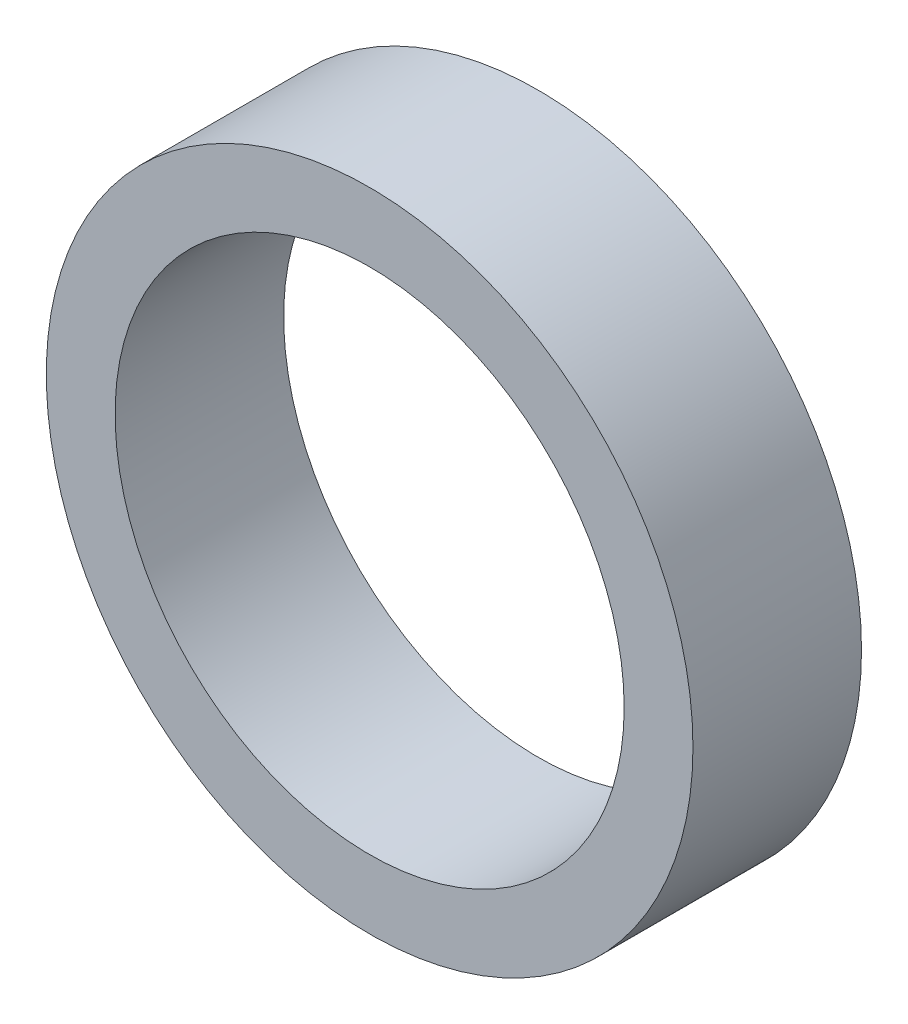
ISO-10303-21;
HEADER;
FILE_DESCRIPTION(('STEP AP214'),'2;1');
FILE_NAME('part.step','',(''),(''),'','','');
FILE_SCHEMA(('AUTOMOTIVE_DESIGN { 1 0 10303 214 1 1 1 1 }'));
ENDSEC;
DATA;
#1=APPLICATION_CONTEXT('core data for automotive mechanical design processes');
#2=APPLICATION_PROTOCOL_DEFINITION('international standard','automotive_design',2000,#1);
#3=PRODUCT_CONTEXT('',#1,'mechanical');
#4=PRODUCT('Part','Part','',(#3));
#5=PRODUCT_RELATED_PRODUCT_CATEGORY('part','',(#4));
#6=PRODUCT_DEFINITION_FORMATION('','',#4);
#7=PRODUCT_DEFINITION_CONTEXT('part definition',#1,'design');
#8=PRODUCT_DEFINITION('design','',#6,#7);
#9=PRODUCT_DEFINITION_SHAPE('','',#8);
#10=(LENGTH_UNIT() NAMED_UNIT(*) SI_UNIT(.MILLI.,.METRE.));
#11=(NAMED_UNIT(*) PLANE_ANGLE_UNIT() SI_UNIT($,.RADIAN.));
#12=(NAMED_UNIT(*) SI_UNIT($,.STERADIAN.) SOLID_ANGLE_UNIT());
#13=UNCERTAINTY_MEASURE_WITH_UNIT(LENGTH_MEASURE(1.E-05),#10,'distance_accuracy_value','');
#14=(GEOMETRIC_REPRESENTATION_CONTEXT(3) GLOBAL_UNCERTAINTY_ASSIGNED_CONTEXT((#13)) GLOBAL_UNIT_ASSIGNED_CONTEXT((#10,
#11,#12)) REPRESENTATION_CONTEXT('',''));
#15=CARTESIAN_POINT('',(0.,0.,0.));
#16=DIRECTION('',(0.,0.,1.));
#17=DIRECTION('',(1.,0.,0.));
#18=AXIS2_PLACEMENT_3D('',#15,#16,#17);
#19=CARTESIAN_POINT('',(0.,0.,4.9));
#20=DIRECTION('',(0.,0.,1.));
#21=DIRECTION('',(1.,0.,0.));
#22=AXIS2_PLACEMENT_3D('',#19,#20,#21);
#23=PLANE('',#22);
#24=CARTESIAN_POINT('',(0.,0.,4.9));
#25=DIRECTION('',(0.,0.,1.));
#26=DIRECTION('',(1.,0.,0.));
#27=AXIS2_PLACEMENT_3D('',#24,#25,#26);
#28=CIRCLE('',#27,9.4);
#29=CARTESIAN_POINT('',(9.4,0.,4.9));
#30=VERTEX_POINT('',#29);
#31=EDGE_CURVE('E11',#30,#30,#28,.T.);
#32=ORIENTED_EDGE('',*,*,#31,.T.);
#33=EDGE_LOOP('',(#32));
#34=FACE_BOUND('',#33,.T.);
#35=CARTESIAN_POINT('',(0.,0.,4.9));
#36=DIRECTION('',(0.,0.,1.));
#37=DIRECTION('',(1.,0.,0.));
#38=AXIS2_PLACEMENT_3D('',#35,#36,#37);
#39=CIRCLE('',#38,7.4);
#40=CARTESIAN_POINT('',(7.4,0.,4.9));
#41=VERTEX_POINT('',#40);
#42=EDGE_CURVE('E56',#41,#41,#39,.T.);
#43=ORIENTED_EDGE('',*,*,#42,.F.);
#44=EDGE_LOOP('',(#43));
#45=FACE_BOUND('',#44,.T.);
#46=ADVANCED_FACE('F45',(#34,#45),#23,.T.);
#47=CARTESIAN_POINT('',(0.,0.,0.));
#48=DIRECTION('',(0.,0.,1.));
#49=DIRECTION('',(1.,0.,0.));
#50=AXIS2_PLACEMENT_3D('',#47,#48,#49);
#51=PLANE('',#50);
#52=CARTESIAN_POINT('',(0.,0.,0.));
#53=DIRECTION('',(0.,0.,1.));
#54=DIRECTION('',(1.,0.,0.));
#55=AXIS2_PLACEMENT_3D('',#52,#53,#54);
#56=CIRCLE('',#55,9.4);
#57=CARTESIAN_POINT('',(9.4,0.,0.));
#58=VERTEX_POINT('',#57);
#59=EDGE_CURVE('E49',#58,#58,#56,.T.);
#60=ORIENTED_EDGE('',*,*,#59,.F.);
#61=EDGE_LOOP('',(#60));
#62=FACE_BOUND('',#61,.T.);
#63=CARTESIAN_POINT('',(0.,0.,0.));
#64=DIRECTION('',(0.,0.,1.));
#65=DIRECTION('',(1.,0.,0.));
#66=AXIS2_PLACEMENT_3D('',#63,#64,#65);
#67=CIRCLE('',#66,7.4);
#68=CARTESIAN_POINT('',(7.4,0.,0.));
#69=VERTEX_POINT('',#68);
#70=EDGE_CURVE('E58',#69,#69,#67,.T.);
#71=ORIENTED_EDGE('',*,*,#70,.T.);
#72=EDGE_LOOP('',(#71));
#73=FACE_BOUND('',#72,.T.);
#74=ADVANCED_FACE('F68',(#62,#73),#51,.F.);
#75=CARTESIAN_POINT('',(0.,0.,4.9));
#76=DIRECTION('',(0.,0.,-1.));
#77=DIRECTION('',(-1.,0.,0.));
#78=AXIS2_PLACEMENT_3D('',#75,#76,#77);
#79=CYLINDRICAL_SURFACE('',#78,9.4);
#80=ORIENTED_EDGE('',*,*,#31,.F.);
#81=EDGE_LOOP('',(#80));
#82=FACE_BOUND('',#81,.T.);
#83=ORIENTED_EDGE('',*,*,#59,.T.);
#84=EDGE_LOOP('',(#83));
#85=FACE_BOUND('',#84,.T.);
#86=ADVANCED_FACE('F47',(#82,#85),#79,.T.);
#87=CARTESIAN_POINT('',(0.,0.,4.9));
#88=DIRECTION('',(0.,0.,-1.));
#89=DIRECTION('',(-1.,0.,0.));
#90=AXIS2_PLACEMENT_3D('',#87,#88,#89);
#91=CYLINDRICAL_SURFACE('',#90,7.4);
#92=ORIENTED_EDGE('',*,*,#42,.T.);
#93=EDGE_LOOP('',(#92));
#94=FACE_BOUND('',#93,.T.);
#95=ORIENTED_EDGE('',*,*,#70,.F.);
#96=EDGE_LOOP('',(#95));
#97=FACE_BOUND('',#96,.T.);
#98=ADVANCED_FACE('F64',(#94,#97),#91,.F.);
#99=CLOSED_SHELL('',(#46,#74,#86,#98));
#100=MANIFOLD_SOLID_BREP('B2',#99);
#101=ADVANCED_BREP_SHAPE_REPRESENTATION('',(#18,#100),#14);
#102=SHAPE_DEFINITION_REPRESENTATION(#9,#101);
ENDSEC;
END-ISO-10303-21;
